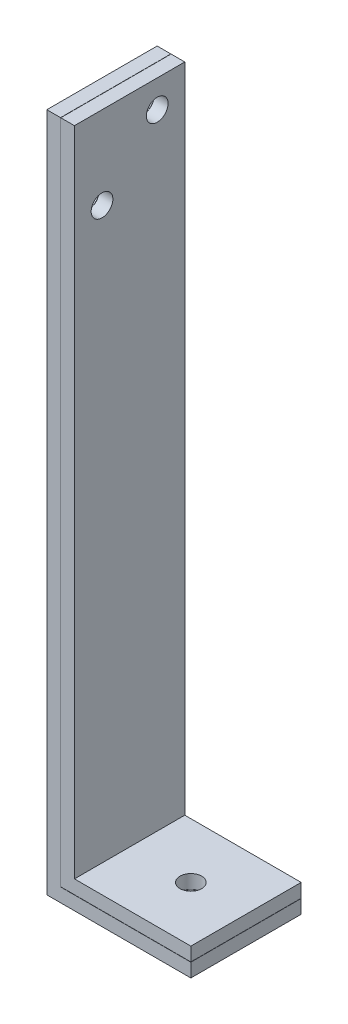
ISO-10303-21;
HEADER;
FILE_DESCRIPTION(('STEP AP214'),'2;1');
FILE_NAME('part.step','',(''),(''),'','','');
FILE_SCHEMA(('AUTOMOTIVE_DESIGN { 1 0 10303 214 1 1 1 1 }'));
ENDSEC;
DATA;
#1=APPLICATION_CONTEXT('core data for automotive mechanical design processes');
#2=APPLICATION_PROTOCOL_DEFINITION('international standard','automotive_design',2000,#1);
#3=PRODUCT_CONTEXT('',#1,'mechanical');
#4=PRODUCT('Part','Part','',(#3));
#5=PRODUCT_RELATED_PRODUCT_CATEGORY('part','',(#4));
#6=PRODUCT_DEFINITION_FORMATION('','',#4);
#7=PRODUCT_DEFINITION_CONTEXT('part definition',#1,'design');
#8=PRODUCT_DEFINITION('design','',#6,#7);
#9=PRODUCT_DEFINITION_SHAPE('','',#8);
#10=(LENGTH_UNIT() NAMED_UNIT(*) SI_UNIT(.MILLI.,.METRE.));
#11=(NAMED_UNIT(*) PLANE_ANGLE_UNIT() SI_UNIT($,.RADIAN.));
#12=(NAMED_UNIT(*) SI_UNIT($,.STERADIAN.) SOLID_ANGLE_UNIT());
#13=UNCERTAINTY_MEASURE_WITH_UNIT(LENGTH_MEASURE(1.E-05),#10,'distance_accuracy_value','');
#14=(GEOMETRIC_REPRESENTATION_CONTEXT(3) GLOBAL_UNCERTAINTY_ASSIGNED_CONTEXT((#13)) GLOBAL_UNIT_ASSIGNED_CONTEXT((#10,
#11,#12)) REPRESENTATION_CONTEXT('',''));
#15=CARTESIAN_POINT('',(0.,0.,0.));
#16=DIRECTION('',(0.,0.,1.));
#17=DIRECTION('',(1.,0.,0.));
#18=AXIS2_PLACEMENT_3D('',#15,#16,#17);
#19=CARTESIAN_POINT('',(12.72,313.04,0.));
#20=DIRECTION('',(1.,0.,0.));
#21=DIRECTION('',(0.,1.,0.));
#22=AXIS2_PLACEMENT_3D('',#19,#20,#21);
#23=PLANE('',#22);
#24=CARTESIAN_POINT('',(12.72,274.939999999963,38.0999999999942));
#25=DIRECTION('',(1.,0.,0.));
#26=DIRECTION('',(0.,1.,0.));
#27=AXIS2_PLACEMENT_3D('',#24,#25,#26);
#28=CIRCLE('',#27,5.);
#29=CARTESIAN_POINT('',(12.72,279.939999999963,38.0999999999942));
#30=VERTEX_POINT('',#29);
#31=EDGE_CURVE('E162',#30,#30,#28,.T.);
#32=ORIENTED_EDGE('',*,*,#31,.F.);
#33=EDGE_LOOP('',(#32));
#34=FACE_BOUND('',#33,.T.);
#35=CARTESIAN_POINT('',(12.72,300.339999999963,12.6999999999918));
#36=DIRECTION('',(1.,0.,0.));
#37=DIRECTION('',(0.,1.,0.));
#38=AXIS2_PLACEMENT_3D('',#35,#36,#37);
#39=CIRCLE('',#38,5.);
#40=CARTESIAN_POINT('',(12.72,305.339999999963,12.6999999999918));
#41=VERTEX_POINT('',#40);
#42=EDGE_CURVE('E154',#41,#41,#39,.T.);
#43=ORIENTED_EDGE('',*,*,#42,.F.);
#44=EDGE_LOOP('',(#43));
#45=FACE_BOUND('',#44,.T.);
#46=DIRECTION('',(0.,1.,0.));
#47=VECTOR('',#46,1.);
#48=CARTESIAN_POINT('',(12.72,313.04,50.8));
#49=LINE('',#48,#47);
#50=CARTESIAN_POINT('',(12.72,12.72,50.8));
#51=VERTEX_POINT('',#50);
#52=CARTESIAN_POINT('',(12.72,313.04,50.8));
#53=VERTEX_POINT('',#52);
#54=EDGE_CURVE('E128',#51,#53,#49,.T.);
#55=ORIENTED_EDGE('',*,*,#54,.F.);
#56=DIRECTION('',(0.,0.,1.));
#57=VECTOR('',#56,1.);
#58=CARTESIAN_POINT('',(12.72,12.72,0.));
#59=LINE('',#58,#57);
#60=CARTESIAN_POINT('',(12.72,12.72,0.));
#61=VERTEX_POINT('',#60);
#62=EDGE_CURVE('E12',#61,#51,#59,.T.);
#63=ORIENTED_EDGE('',*,*,#62,.F.);
#64=DIRECTION('',(0.,1.,0.));
#65=VECTOR('',#64,1.);
#66=CARTESIAN_POINT('',(12.72,313.04,0.));
#67=LINE('',#66,#65);
#68=CARTESIAN_POINT('',(12.72,313.04,0.));
#69=VERTEX_POINT('',#68);
#70=EDGE_CURVE('E143',#61,#69,#67,.T.);
#71=ORIENTED_EDGE('',*,*,#70,.T.);
#72=DIRECTION('',(0.,0.,1.));
#73=VECTOR('',#72,1.);
#74=CARTESIAN_POINT('',(12.72,313.04,0.));
#75=LINE('',#74,#73);
#76=EDGE_CURVE('E92',#69,#53,#75,.T.);
#77=ORIENTED_EDGE('',*,*,#76,.T.);
#78=EDGE_LOOP('',(#55,#63,#71,#77));
#79=FACE_BOUND('',#78,.T.);
#80=ADVANCED_FACE('F42',(#34,#45,#79),#23,.T.);
#81=CARTESIAN_POINT('',(12.72,12.72,0.));
#82=DIRECTION('',(0.,1.,0.));
#83=DIRECTION('',(-1.,0.,0.));
#84=AXIS2_PLACEMENT_3D('',#81,#82,#83);
#85=PLANE('',#84);
#86=CARTESIAN_POINT('',(40.91000000001,12.72,25.3999999999948));
#87=DIRECTION('',(0.,1.,0.));
#88=DIRECTION('',(-1.,0.,0.));
#89=AXIS2_PLACEMENT_3D('',#86,#87,#88);
#90=CIRCLE('',#89,5.);
#91=CARTESIAN_POINT('',(35.91000000001,12.72,25.3999999999948));
#92=VERTEX_POINT('',#91);
#93=EDGE_CURVE('E151',#92,#92,#90,.T.);
#94=ORIENTED_EDGE('',*,*,#93,.F.);
#95=EDGE_LOOP('',(#94));
#96=FACE_BOUND('',#95,.T.);
#97=DIRECTION('',(-1.,0.,0.));
#98=VECTOR('',#97,1.);
#99=CARTESIAN_POINT('',(12.72,12.72,50.8));
#100=LINE('',#99,#98);
#101=CARTESIAN_POINT('',(66.31,12.72,50.8));
#102=VERTEX_POINT('',#101);
#103=EDGE_CURVE('E141',#102,#51,#100,.T.);
#104=ORIENTED_EDGE('',*,*,#103,.F.);
#105=DIRECTION('',(0.,0.,1.));
#106=VECTOR('',#105,1.);
#107=CARTESIAN_POINT('',(66.31,12.72,0.));
#108=LINE('',#107,#106);
#109=CARTESIAN_POINT('',(66.31,12.72,0.));
#110=VERTEX_POINT('',#109);
#111=EDGE_CURVE('E51',#110,#102,#108,.T.);
#112=ORIENTED_EDGE('',*,*,#111,.F.);
#113=DIRECTION('',(-1.,0.,0.));
#114=VECTOR('',#113,1.);
#115=CARTESIAN_POINT('',(12.72,12.72,0.));
#116=LINE('',#115,#114);
#117=EDGE_CURVE('E118',#110,#61,#116,.T.);
#118=ORIENTED_EDGE('',*,*,#117,.T.);
#119=ORIENTED_EDGE('',*,*,#62,.T.);
#120=EDGE_LOOP('',(#104,#112,#118,#119));
#121=FACE_BOUND('',#120,.T.);
#122=ADVANCED_FACE('F172',(#96,#121),#85,.T.);
#123=CARTESIAN_POINT('',(66.31,12.72,0.));
#124=DIRECTION('',(1.,0.,0.));
#125=DIRECTION('',(0.,0.,-1.));
#126=AXIS2_PLACEMENT_3D('',#123,#124,#125);
#127=PLANE('',#126);
#128=DIRECTION('',(0.,1.,0.));
#129=VECTOR('',#128,1.);
#130=CARTESIAN_POINT('',(66.31,12.72,50.8));
#131=LINE('',#130,#129);
#132=CARTESIAN_POINT('',(66.31,6.41,50.8));
#133=VERTEX_POINT('',#132);
#134=EDGE_CURVE('E105',#133,#102,#131,.T.);
#135=ORIENTED_EDGE('',*,*,#134,.F.);
#136=DIRECTION('',(0.,0.,1.));
#137=VECTOR('',#136,1.);
#138=CARTESIAN_POINT('',(66.31,6.41,0.));
#139=LINE('',#138,#137);
#140=CARTESIAN_POINT('',(66.31,6.41,0.));
#141=VERTEX_POINT('',#140);
#142=EDGE_CURVE('E100',#141,#133,#139,.T.);
#143=ORIENTED_EDGE('',*,*,#142,.F.);
#144=DIRECTION('',(0.,1.,0.));
#145=VECTOR('',#144,1.);
#146=CARTESIAN_POINT('',(66.31,12.72,0.));
#147=LINE('',#146,#145);
#148=EDGE_CURVE('E103',#141,#110,#147,.T.);
#149=ORIENTED_EDGE('',*,*,#148,.T.);
#150=ORIENTED_EDGE('',*,*,#111,.T.);
#151=EDGE_LOOP('',(#135,#143,#149,#150));
#152=FACE_BOUND('',#151,.T.);
#153=ADVANCED_FACE('F102',(#152),#127,.T.);
#154=CARTESIAN_POINT('',(66.31,6.41,0.));
#155=DIRECTION('',(0.,-1.,0.));
#156=DIRECTION('',(1.,0.,0.));
#157=AXIS2_PLACEMENT_3D('',#154,#155,#156);
#158=PLANE('',#157);
#159=CARTESIAN_POINT('',(40.91000000001,6.41,25.3999999999948));
#160=DIRECTION('',(0.,-1.,0.));
#161=DIRECTION('',(1.,0.,0.));
#162=AXIS2_PLACEMENT_3D('',#159,#160,#161);
#163=CIRCLE('',#162,5.);
#164=CARTESIAN_POINT('',(45.91000000001,6.41,25.3999999999948));
#165=VERTEX_POINT('',#164);
#166=EDGE_CURVE('E132',#165,#165,#163,.T.);
#167=ORIENTED_EDGE('',*,*,#166,.F.);
#168=EDGE_LOOP('',(#167));
#169=FACE_BOUND('',#168,.T.);
#170=DIRECTION('',(1.,0.,0.));
#171=VECTOR('',#170,1.);
#172=CARTESIAN_POINT('',(66.31,6.41,50.8));
#173=LINE('',#172,#171);
#174=CARTESIAN_POINT('',(6.41,6.40999999999999,50.8));
#175=VERTEX_POINT('',#174);
#176=EDGE_CURVE('E138',#175,#133,#173,.T.);
#177=ORIENTED_EDGE('',*,*,#176,.F.);
#178=DIRECTION('',(0.,0.,1.));
#179=VECTOR('',#178,1.);
#180=CARTESIAN_POINT('',(6.41,6.40999999999999,0.));
#181=LINE('',#180,#179);
#182=CARTESIAN_POINT('',(6.41,6.40999999999999,0.));
#183=VERTEX_POINT('',#182);
#184=EDGE_CURVE('E110',#183,#175,#181,.T.);
#185=ORIENTED_EDGE('',*,*,#184,.F.);
#186=DIRECTION('',(1.,0.,0.));
#187=VECTOR('',#186,1.);
#188=CARTESIAN_POINT('',(66.31,6.41,0.));
#189=LINE('',#188,#187);
#190=EDGE_CURVE('E116',#183,#141,#189,.T.);
#191=ORIENTED_EDGE('',*,*,#190,.T.);
#192=ORIENTED_EDGE('',*,*,#142,.T.);
#193=EDGE_LOOP('',(#177,#185,#191,#192));
#194=FACE_BOUND('',#193,.T.);
#195=ADVANCED_FACE('F120',(#169,#194),#158,.T.);
#196=CARTESIAN_POINT('',(6.41,6.40999999999999,0.));
#197=DIRECTION('',(-1.,0.,0.));
#198=DIRECTION('',(0.,-1.,0.));
#199=AXIS2_PLACEMENT_3D('',#196,#197,#198);
#200=PLANE('',#199);
#201=CARTESIAN_POINT('',(6.41,274.939999999963,38.0999999999942));
#202=DIRECTION('',(-1.,0.,0.));
#203=DIRECTION('',(0.,-1.,0.));
#204=AXIS2_PLACEMENT_3D('',#201,#202,#203);
#205=CIRCLE('',#204,5.);
#206=CARTESIAN_POINT('',(6.41,269.939999999963,38.0999999999942));
#207=VERTEX_POINT('',#206);
#208=EDGE_CURVE('E45',#207,#207,#205,.T.);
#209=ORIENTED_EDGE('',*,*,#208,.F.);
#210=EDGE_LOOP('',(#209));
#211=FACE_BOUND('',#210,.T.);
#212=CARTESIAN_POINT('',(6.41,300.339999999963,12.6999999999918));
#213=DIRECTION('',(-1.,0.,0.));
#214=DIRECTION('',(0.,-1.,0.));
#215=AXIS2_PLACEMENT_3D('',#212,#213,#214);
#216=CIRCLE('',#215,5.);
#217=CARTESIAN_POINT('',(6.41,295.339999999963,12.6999999999918));
#218=VERTEX_POINT('',#217);
#219=EDGE_CURVE('E152',#218,#218,#216,.T.);
#220=ORIENTED_EDGE('',*,*,#219,.F.);
#221=EDGE_LOOP('',(#220));
#222=FACE_BOUND('',#221,.T.);
#223=DIRECTION('',(0.,-1.,0.));
#224=VECTOR('',#223,1.);
#225=CARTESIAN_POINT('',(6.41,6.40999999999999,50.8));
#226=LINE('',#225,#224);
#227=CARTESIAN_POINT('',(6.41,313.04,50.8));
#228=VERTEX_POINT('',#227);
#229=EDGE_CURVE('E135',#228,#175,#226,.T.);
#230=ORIENTED_EDGE('',*,*,#229,.F.);
#231=DIRECTION('',(0.,0.,1.));
#232=VECTOR('',#231,1.);
#233=CARTESIAN_POINT('',(6.41,313.04,0.));
#234=LINE('',#233,#232);
#235=CARTESIAN_POINT('',(6.41,313.04,0.));
#236=VERTEX_POINT('',#235);
#237=EDGE_CURVE('E147',#236,#228,#234,.T.);
#238=ORIENTED_EDGE('',*,*,#237,.F.);
#239=DIRECTION('',(0.,-1.,0.));
#240=VECTOR('',#239,1.);
#241=CARTESIAN_POINT('',(6.41,6.40999999999999,0.));
#242=LINE('',#241,#240);
#243=EDGE_CURVE('E121',#236,#183,#242,.T.);
#244=ORIENTED_EDGE('',*,*,#243,.T.);
#245=ORIENTED_EDGE('',*,*,#184,.T.);
#246=EDGE_LOOP('',(#230,#238,#244,#245));
#247=FACE_BOUND('',#246,.T.);
#248=ADVANCED_FACE('F188',(#211,#222,#247),#200,.T.);
#249=CARTESIAN_POINT('',(6.41,313.04,0.));
#250=DIRECTION('',(0.,1.,0.));
#251=DIRECTION('',(0.,0.,1.));
#252=AXIS2_PLACEMENT_3D('',#249,#250,#251);
#253=PLANE('',#252);
#254=DIRECTION('',(-1.,0.,0.));
#255=VECTOR('',#254,1.);
#256=CARTESIAN_POINT('',(6.41,313.04,50.8));
#257=LINE('',#256,#255);
#258=EDGE_CURVE('E131',#53,#228,#257,.T.);
#259=ORIENTED_EDGE('',*,*,#258,.F.);
#260=ORIENTED_EDGE('',*,*,#76,.F.);
#261=DIRECTION('',(-1.,0.,0.));
#262=VECTOR('',#261,1.);
#263=CARTESIAN_POINT('',(6.41,313.04,0.));
#264=LINE('',#263,#262);
#265=EDGE_CURVE('E123',#69,#236,#264,.T.);
#266=ORIENTED_EDGE('',*,*,#265,.T.);
#267=ORIENTED_EDGE('',*,*,#237,.T.);
#268=EDGE_LOOP('',(#259,#260,#266,#267));
#269=FACE_BOUND('',#268,.T.);
#270=ADVANCED_FACE('F168',(#269),#253,.T.);
#271=CARTESIAN_POINT('',(0.,0.,0.));
#272=DIRECTION('',(0.,0.,1.));
#273=DIRECTION('',(1.,0.,0.));
#274=AXIS2_PLACEMENT_3D('',#271,#272,#273);
#275=PLANE('',#274);
#276=ORIENTED_EDGE('',*,*,#70,.F.);
#277=ORIENTED_EDGE('',*,*,#117,.F.);
#278=ORIENTED_EDGE('',*,*,#148,.F.);
#279=ORIENTED_EDGE('',*,*,#190,.F.);
#280=ORIENTED_EDGE('',*,*,#243,.F.);
#281=ORIENTED_EDGE('',*,*,#265,.F.);
#282=EDGE_LOOP('',(#276,#277,#278,#279,#280,#281));
#283=FACE_BOUND('',#282,.T.);
#284=ADVANCED_FACE('F114',(#283),#275,.F.);
#285=CARTESIAN_POINT('',(0.,0.,50.8));
#286=DIRECTION('',(0.,0.,1.));
#287=DIRECTION('',(1.,0.,0.));
#288=AXIS2_PLACEMENT_3D('',#285,#286,#287);
#289=PLANE('',#288);
#290=ORIENTED_EDGE('',*,*,#54,.T.);
#291=ORIENTED_EDGE('',*,*,#258,.T.);
#292=ORIENTED_EDGE('',*,*,#229,.T.);
#293=ORIENTED_EDGE('',*,*,#176,.T.);
#294=ORIENTED_EDGE('',*,*,#134,.T.);
#295=ORIENTED_EDGE('',*,*,#103,.T.);
#296=EDGE_LOOP('',(#290,#291,#292,#293,#294,#295));
#297=FACE_BOUND('',#296,.T.);
#298=ADVANCED_FACE('F171',(#297),#289,.T.);
#299=CARTESIAN_POINT('',(40.91000000001,-11.805,25.3999999999948));
#300=DIRECTION('',(0.,1.,0.));
#301=DIRECTION('',(-1.,0.,0.));
#302=AXIS2_PLACEMENT_3D('',#299,#300,#301);
#303=CYLINDRICAL_SURFACE('',#302,5.);
#304=ORIENTED_EDGE('',*,*,#166,.T.);
#305=EDGE_LOOP('',(#304));
#306=FACE_BOUND('',#305,.T.);
#307=ORIENTED_EDGE('',*,*,#93,.T.);
#308=EDGE_LOOP('',(#307));
#309=FACE_BOUND('',#308,.T.);
#310=ADVANCED_FACE('F199',(#306,#309),#303,.F.);
#311=CARTESIAN_POINT('',(29.,300.339999999963,12.6999999999918));
#312=DIRECTION('',(-1.,0.,0.));
#313=DIRECTION('',(0.,0.,1.));
#314=AXIS2_PLACEMENT_3D('',#311,#312,#313);
#315=CYLINDRICAL_SURFACE('',#314,5.);
#316=ORIENTED_EDGE('',*,*,#42,.T.);
#317=EDGE_LOOP('',(#316));
#318=FACE_BOUND('',#317,.T.);
#319=ORIENTED_EDGE('',*,*,#219,.T.);
#320=EDGE_LOOP('',(#319));
#321=FACE_BOUND('',#320,.T.);
#322=ADVANCED_FACE('F203',(#318,#321),#315,.F.);
#323=CARTESIAN_POINT('',(29.,274.939999999963,38.0999999999942));
#324=DIRECTION('',(-1.,0.,0.));
#325=DIRECTION('',(0.,0.,1.));
#326=AXIS2_PLACEMENT_3D('',#323,#324,#325);
#327=CYLINDRICAL_SURFACE('',#326,5.);
#328=ORIENTED_EDGE('',*,*,#31,.T.);
#329=EDGE_LOOP('',(#328));
#330=FACE_BOUND('',#329,.T.);
#331=ORIENTED_EDGE('',*,*,#208,.T.);
#332=EDGE_LOOP('',(#331));
#333=FACE_BOUND('',#332,.T.);
#334=ADVANCED_FACE('F207',(#330,#333),#327,.F.);
#335=CLOSED_SHELL('',(#80,#122,#153,#195,#248,#270,#284,#298,#310,#322,#334));
#336=MANIFOLD_SOLID_BREP('B2',#335);
#337=CARTESIAN_POINT('',(0.,0.,50.8));
#338=DIRECTION('',(1.,0.,0.));
#339=DIRECTION('',(0.,0.,-1.));
#340=AXIS2_PLACEMENT_3D('',#337,#338,#339);
#341=PLANE('',#340);
#342=CARTESIAN_POINT('',(0.,274.939999999963,38.0999999999942));
#343=DIRECTION('',(-1.,0.,0.));
#344=DIRECTION('',(0.,0.,1.));
#345=AXIS2_PLACEMENT_3D('',#342,#343,#344);
#346=CIRCLE('',#345,5.);
#347=CARTESIAN_POINT('',(0.,274.939999999963,43.0999999999942));
#348=VERTEX_POINT('',#347);
#349=EDGE_CURVE('E387',#348,#348,#346,.T.);
#350=ORIENTED_EDGE('',*,*,#349,.F.);
#351=EDGE_LOOP('',(#350));
#352=FACE_BOUND('',#351,.T.);
#353=CARTESIAN_POINT('',(0.,300.339999999963,12.6999999999918));
#354=DIRECTION('',(-1.,0.,0.));
#355=DIRECTION('',(0.,0.,1.));
#356=AXIS2_PLACEMENT_3D('',#353,#354,#355);
#357=CIRCLE('',#356,5.);
#358=CARTESIAN_POINT('',(0.,300.339999999963,17.6999999999918));
#359=VERTEX_POINT('',#358);
#360=EDGE_CURVE('E392',#359,#359,#357,.T.);
#361=ORIENTED_EDGE('',*,*,#360,.F.);
#362=EDGE_LOOP('',(#361));
#363=FACE_BOUND('',#362,.T.);
#364=DIRECTION('',(0.,-1.,0.));
#365=VECTOR('',#364,1.);
#366=CARTESIAN_POINT('',(0.,0.,0.));
#367=LINE('',#366,#365);
#368=CARTESIAN_POINT('',(0.,313.04,0.));
#369=VERTEX_POINT('',#368);
#370=CARTESIAN_POINT('',(0.,0.,0.));
#371=VERTEX_POINT('',#370);
#372=EDGE_CURVE('E366',#369,#371,#367,.T.);
#373=ORIENTED_EDGE('',*,*,#372,.T.);
#374=DIRECTION('',(0.,0.,-1.));
#375=VECTOR('',#374,1.);
#376=CARTESIAN_POINT('',(0.,0.,50.8));
#377=LINE('',#376,#375);
#378=CARTESIAN_POINT('',(0.,0.,50.8));
#379=VERTEX_POINT('',#378);
#380=EDGE_CURVE('E40',#379,#371,#377,.T.);
#381=ORIENTED_EDGE('',*,*,#380,.F.);
#382=DIRECTION('',(0.,-1.,0.));
#383=VECTOR('',#382,1.);
#384=CARTESIAN_POINT('',(0.,0.,50.8));
#385=LINE('',#384,#383);
#386=CARTESIAN_POINT('',(0.,313.04,50.8));
#387=VERTEX_POINT('',#386);
#388=EDGE_CURVE('E377',#387,#379,#385,.T.);
#389=ORIENTED_EDGE('',*,*,#388,.F.);
#390=DIRECTION('',(0.,0.,-1.));
#391=VECTOR('',#390,1.);
#392=CARTESIAN_POINT('',(0.,313.04,50.8));
#393=LINE('',#392,#391);
#394=EDGE_CURVE('E362',#387,#369,#393,.T.);
#395=ORIENTED_EDGE('',*,*,#394,.T.);
#396=EDGE_LOOP('',(#373,#381,#389,#395));
#397=FACE_BOUND('',#396,.T.);
#398=ADVANCED_FACE('F280',(#352,#363,#397),#341,.F.);
#399=CARTESIAN_POINT('',(0.,0.,50.8));
#400=DIRECTION('',(0.,1.,0.));
#401=DIRECTION('',(0.,0.,1.));
#402=AXIS2_PLACEMENT_3D('',#399,#400,#401);
#403=PLANE('',#402);
#404=CARTESIAN_POINT('',(40.91000000001,0.,25.3999999999948));
#405=DIRECTION('',(0.,1.,0.));
#406=DIRECTION('',(0.,0.,1.));
#407=AXIS2_PLACEMENT_3D('',#404,#405,#406);
#408=CIRCLE('',#407,5.);
#409=CARTESIAN_POINT('',(40.91000000001,0.,30.3999999999948));
#410=VERTEX_POINT('',#409);
#411=EDGE_CURVE('E370',#410,#410,#408,.T.);
#412=ORIENTED_EDGE('',*,*,#411,.T.);
#413=EDGE_LOOP('',(#412));
#414=FACE_BOUND('',#413,.T.);
#415=DIRECTION('',(1.,0.,0.));
#416=VECTOR('',#415,1.);
#417=CARTESIAN_POINT('',(0.,0.,0.));
#418=LINE('',#417,#416);
#419=CARTESIAN_POINT('',(66.31,0.,0.));
#420=VERTEX_POINT('',#419);
#421=EDGE_CURVE('E369',#371,#420,#418,.T.);
#422=ORIENTED_EDGE('',*,*,#421,.T.);
#423=DIRECTION('',(0.,0.,-1.));
#424=VECTOR('',#423,1.);
#425=CARTESIAN_POINT('',(66.31,0.,50.8));
#426=LINE('',#425,#424);
#427=CARTESIAN_POINT('',(66.31,0.,50.8));
#428=VERTEX_POINT('',#427);
#429=EDGE_CURVE('E289',#428,#420,#426,.T.);
#430=ORIENTED_EDGE('',*,*,#429,.F.);
#431=DIRECTION('',(1.,0.,0.));
#432=VECTOR('',#431,1.);
#433=CARTESIAN_POINT('',(0.,0.,50.8));
#434=LINE('',#433,#432);
#435=EDGE_CURVE('E335',#379,#428,#434,.T.);
#436=ORIENTED_EDGE('',*,*,#435,.F.);
#437=ORIENTED_EDGE('',*,*,#380,.T.);
#438=EDGE_LOOP('',(#422,#430,#436,#437));
#439=FACE_BOUND('',#438,.T.);
#440=ADVANCED_FACE('F404',(#414,#439),#403,.F.);
#441=CARTESIAN_POINT('',(66.31,6.31,50.8));
#442=DIRECTION('',(-1.,0.,0.));
#443=DIRECTION('',(0.,0.,1.));
#444=AXIS2_PLACEMENT_3D('',#441,#442,#443);
#445=PLANE('',#444);
#446=DIRECTION('',(0.,1.,0.));
#447=VECTOR('',#446,1.);
#448=CARTESIAN_POINT('',(66.31,6.31,0.));
#449=LINE('',#448,#447);
#450=CARTESIAN_POINT('',(66.31,6.31,0.));
#451=VERTEX_POINT('',#450);
#452=EDGE_CURVE('E372',#420,#451,#449,.T.);
#453=ORIENTED_EDGE('',*,*,#452,.T.);
#454=DIRECTION('',(0.,0.,-1.));
#455=VECTOR('',#454,1.);
#456=CARTESIAN_POINT('',(66.31,6.31,50.8));
#457=LINE('',#456,#455);
#458=CARTESIAN_POINT('',(66.31,6.31,50.8));
#459=VERTEX_POINT('',#458);
#460=EDGE_CURVE('E357',#459,#451,#457,.T.);
#461=ORIENTED_EDGE('',*,*,#460,.F.);
#462=DIRECTION('',(0.,1.,0.));
#463=VECTOR('',#462,1.);
#464=CARTESIAN_POINT('',(66.31,6.31,50.8));
#465=LINE('',#464,#463);
#466=EDGE_CURVE('E348',#428,#459,#465,.T.);
#467=ORIENTED_EDGE('',*,*,#466,.F.);
#468=ORIENTED_EDGE('',*,*,#429,.T.);
#469=EDGE_LOOP('',(#453,#461,#467,#468));
#470=FACE_BOUND('',#469,.T.);
#471=ADVANCED_FACE('F407',(#470),#445,.F.);
#472=CARTESIAN_POINT('',(6.31,6.31,50.8));
#473=DIRECTION('',(0.,-1.,0.));
#474=DIRECTION('',(0.,0.,-1.));
#475=AXIS2_PLACEMENT_3D('',#472,#473,#474);
#476=PLANE('',#475);
#477=CARTESIAN_POINT('',(40.91000000001,6.31,25.3999999999948));
#478=DIRECTION('',(0.,-1.,0.));
#479=DIRECTION('',(0.,0.,-1.));
#480=AXIS2_PLACEMENT_3D('',#477,#478,#479);
#481=CIRCLE('',#480,5.);
#482=CARTESIAN_POINT('',(40.91000000001,6.31,20.3999999999948));
#483=VERTEX_POINT('',#482);
#484=EDGE_CURVE('E383',#483,#483,#481,.T.);
#485=ORIENTED_EDGE('',*,*,#484,.T.);
#486=EDGE_LOOP('',(#485));
#487=FACE_BOUND('',#486,.T.);
#488=DIRECTION('',(-1.,0.,0.));
#489=VECTOR('',#488,1.);
#490=CARTESIAN_POINT('',(6.31,6.31,0.));
#491=LINE('',#490,#489);
#492=CARTESIAN_POINT('',(6.31,6.31,0.));
#493=VERTEX_POINT('',#492);
#494=EDGE_CURVE('E356',#451,#493,#491,.T.);
#495=ORIENTED_EDGE('',*,*,#494,.T.);
#496=DIRECTION('',(0.,0.,-1.));
#497=VECTOR('',#496,1.);
#498=CARTESIAN_POINT('',(6.31,6.31,50.8));
#499=LINE('',#498,#497);
#500=CARTESIAN_POINT('',(6.31,6.31,50.8));
#501=VERTEX_POINT('',#500);
#502=EDGE_CURVE('E353',#501,#493,#499,.T.);
#503=ORIENTED_EDGE('',*,*,#502,.F.);
#504=DIRECTION('',(-1.,0.,0.));
#505=VECTOR('',#504,1.);
#506=CARTESIAN_POINT('',(6.31,6.31,50.8));
#507=LINE('',#506,#505);
#508=EDGE_CURVE('E342',#459,#501,#507,.T.);
#509=ORIENTED_EDGE('',*,*,#508,.F.);
#510=ORIENTED_EDGE('',*,*,#460,.T.);
#511=EDGE_LOOP('',(#495,#503,#509,#510));
#512=FACE_BOUND('',#511,.T.);
#513=ADVANCED_FACE('F354',(#487,#512),#476,.F.);
#514=CARTESIAN_POINT('',(6.31,6.31,50.8));
#515=DIRECTION('',(-1.,0.,0.));
#516=DIRECTION('',(0.,0.,1.));
#517=AXIS2_PLACEMENT_3D('',#514,#515,#516);
#518=PLANE('',#517);
#519=CARTESIAN_POINT('',(6.31,274.939999999963,38.0999999999942));
#520=DIRECTION('',(-1.,0.,0.));
#521=DIRECTION('',(0.,0.,1.));
#522=AXIS2_PLACEMENT_3D('',#519,#520,#521);
#523=CIRCLE('',#522,5.);
#524=CARTESIAN_POINT('',(6.31,274.939999999963,43.0999999999942));
#525=VERTEX_POINT('',#524);
#526=EDGE_CURVE('E283',#525,#525,#523,.T.);
#527=ORIENTED_EDGE('',*,*,#526,.T.);
#528=EDGE_LOOP('',(#527));
#529=FACE_BOUND('',#528,.T.);
#530=CARTESIAN_POINT('',(6.31,300.339999999963,12.6999999999918));
#531=DIRECTION('',(-1.,0.,0.));
#532=DIRECTION('',(0.,0.,1.));
#533=AXIS2_PLACEMENT_3D('',#530,#531,#532);
#534=CIRCLE('',#533,5.);
#535=CARTESIAN_POINT('',(6.31,300.339999999963,17.6999999999918));
#536=VERTEX_POINT('',#535);
#537=EDGE_CURVE('E385',#536,#536,#534,.T.);
#538=ORIENTED_EDGE('',*,*,#537,.T.);
#539=EDGE_LOOP('',(#538));
#540=FACE_BOUND('',#539,.T.);
#541=DIRECTION('',(0.,1.,0.));
#542=VECTOR('',#541,1.);
#543=CARTESIAN_POINT('',(6.31,6.31,0.));
#544=LINE('',#543,#542);
#545=CARTESIAN_POINT('',(6.31,313.04,0.));
#546=VERTEX_POINT('',#545);
#547=EDGE_CURVE('E321',#493,#546,#544,.T.);
#548=ORIENTED_EDGE('',*,*,#547,.T.);
#549=DIRECTION('',(0.,0.,-1.));
#550=VECTOR('',#549,1.);
#551=CARTESIAN_POINT('',(6.31,313.04,50.8));
#552=LINE('',#551,#550);
#553=CARTESIAN_POINT('',(6.31,313.04,50.8));
#554=VERTEX_POINT('',#553);
#555=EDGE_CURVE('E358',#554,#546,#552,.T.);
#556=ORIENTED_EDGE('',*,*,#555,.F.);
#557=DIRECTION('',(0.,1.,0.));
#558=VECTOR('',#557,1.);
#559=CARTESIAN_POINT('',(6.31,6.31,50.8));
#560=LINE('',#559,#558);
#561=EDGE_CURVE('E346',#501,#554,#560,.T.);
#562=ORIENTED_EDGE('',*,*,#561,.F.);
#563=ORIENTED_EDGE('',*,*,#502,.T.);
#564=EDGE_LOOP('',(#548,#556,#562,#563));
#565=FACE_BOUND('',#564,.T.);
#566=ADVANCED_FACE('F360',(#529,#540,#565),#518,.F.);
#567=CARTESIAN_POINT('',(6.31,313.04,50.8));
#568=DIRECTION('',(0.,-1.,0.));
#569=DIRECTION('',(0.,0.,-1.));
#570=AXIS2_PLACEMENT_3D('',#567,#568,#569);
#571=PLANE('',#570);
#572=DIRECTION('',(-1.,0.,0.));
#573=VECTOR('',#572,1.);
#574=CARTESIAN_POINT('',(6.31,313.04,0.));
#575=LINE('',#574,#573);
#576=EDGE_CURVE('E327',#546,#369,#575,.T.);
#577=ORIENTED_EDGE('',*,*,#576,.T.);
#578=ORIENTED_EDGE('',*,*,#394,.F.);
#579=DIRECTION('',(-1.,0.,0.));
#580=VECTOR('',#579,1.);
#581=CARTESIAN_POINT('',(6.31,313.04,50.8));
#582=LINE('',#581,#580);
#583=EDGE_CURVE('E298',#554,#387,#582,.T.);
#584=ORIENTED_EDGE('',*,*,#583,.F.);
#585=ORIENTED_EDGE('',*,*,#555,.T.);
#586=EDGE_LOOP('',(#577,#578,#584,#585));
#587=FACE_BOUND('',#586,.T.);
#588=ADVANCED_FACE('F412',(#587),#571,.F.);
#589=CARTESIAN_POINT('',(0.,0.,50.8));
#590=DIRECTION('',(0.,0.,1.));
#591=DIRECTION('',(1.,0.,0.));
#592=AXIS2_PLACEMENT_3D('',#589,#590,#591);
#593=PLANE('',#592);
#594=ORIENTED_EDGE('',*,*,#388,.T.);
#595=ORIENTED_EDGE('',*,*,#435,.T.);
#596=ORIENTED_EDGE('',*,*,#466,.T.);
#597=ORIENTED_EDGE('',*,*,#508,.T.);
#598=ORIENTED_EDGE('',*,*,#561,.T.);
#599=ORIENTED_EDGE('',*,*,#583,.T.);
#600=EDGE_LOOP('',(#594,#595,#596,#597,#598,#599));
#601=FACE_BOUND('',#600,.T.);
#602=ADVANCED_FACE('F344',(#601),#593,.T.);
#603=CARTESIAN_POINT('',(0.,0.,0.));
#604=DIRECTION('',(0.,0.,1.));
#605=DIRECTION('',(1.,0.,0.));
#606=AXIS2_PLACEMENT_3D('',#603,#604,#605);
#607=PLANE('',#606);
#608=ORIENTED_EDGE('',*,*,#372,.F.);
#609=ORIENTED_EDGE('',*,*,#576,.F.);
#610=ORIENTED_EDGE('',*,*,#547,.F.);
#611=ORIENTED_EDGE('',*,*,#494,.F.);
#612=ORIENTED_EDGE('',*,*,#452,.F.);
#613=ORIENTED_EDGE('',*,*,#421,.F.);
#614=EDGE_LOOP('',(#608,#609,#610,#611,#612,#613));
#615=FACE_BOUND('',#614,.T.);
#616=ADVANCED_FACE('F410',(#615),#607,.F.);
#617=CARTESIAN_POINT('',(40.91000000001,-11.805,25.3999999999948));
#618=DIRECTION('',(0.,1.,0.));
#619=DIRECTION('',(-1.,0.,0.));
#620=AXIS2_PLACEMENT_3D('',#617,#618,#619);
#621=CYLINDRICAL_SURFACE('',#620,5.);
#622=ORIENTED_EDGE('',*,*,#484,.F.);
#623=EDGE_LOOP('',(#622));
#624=FACE_BOUND('',#623,.T.);
#625=ORIENTED_EDGE('',*,*,#411,.F.);
#626=EDGE_LOOP('',(#625));
#627=FACE_BOUND('',#626,.T.);
#628=ADVANCED_FACE('F436',(#624,#627),#621,.F.);
#629=CARTESIAN_POINT('',(29.,300.339999999963,12.6999999999918));
#630=DIRECTION('',(-1.,0.,0.));
#631=DIRECTION('',(0.,0.,1.));
#632=AXIS2_PLACEMENT_3D('',#629,#630,#631);
#633=CYLINDRICAL_SURFACE('',#632,5.);
#634=ORIENTED_EDGE('',*,*,#360,.T.);
#635=EDGE_LOOP('',(#634));
#636=FACE_BOUND('',#635,.T.);
#637=ORIENTED_EDGE('',*,*,#537,.F.);
#638=EDGE_LOOP('',(#637));
#639=FACE_BOUND('',#638,.T.);
#640=ADVANCED_FACE('F432',(#636,#639),#633,.F.);
#641=CARTESIAN_POINT('',(29.,274.939999999963,38.0999999999942));
#642=DIRECTION('',(-1.,0.,0.));
#643=DIRECTION('',(0.,0.,1.));
#644=AXIS2_PLACEMENT_3D('',#641,#642,#643);
#645=CYLINDRICAL_SURFACE('',#644,5.);
#646=ORIENTED_EDGE('',*,*,#349,.T.);
#647=EDGE_LOOP('',(#646));
#648=FACE_BOUND('',#647,.T.);
#649=ORIENTED_EDGE('',*,*,#526,.F.);
#650=EDGE_LOOP('',(#649));
#651=FACE_BOUND('',#650,.T.);
#652=ADVANCED_FACE('F435',(#648,#651),#645,.F.);
#653=CLOSED_SHELL('',(#398,#440,#471,#513,#566,#588,#602,#616,#628,#640,#652));
#654=MANIFOLD_SOLID_BREP('B6',#653);
#655=ADVANCED_BREP_SHAPE_REPRESENTATION('',(#18,#336,#654),#14);
#656=SHAPE_DEFINITION_REPRESENTATION(#9,#655);
ENDSEC;
END-ISO-10303-21;
